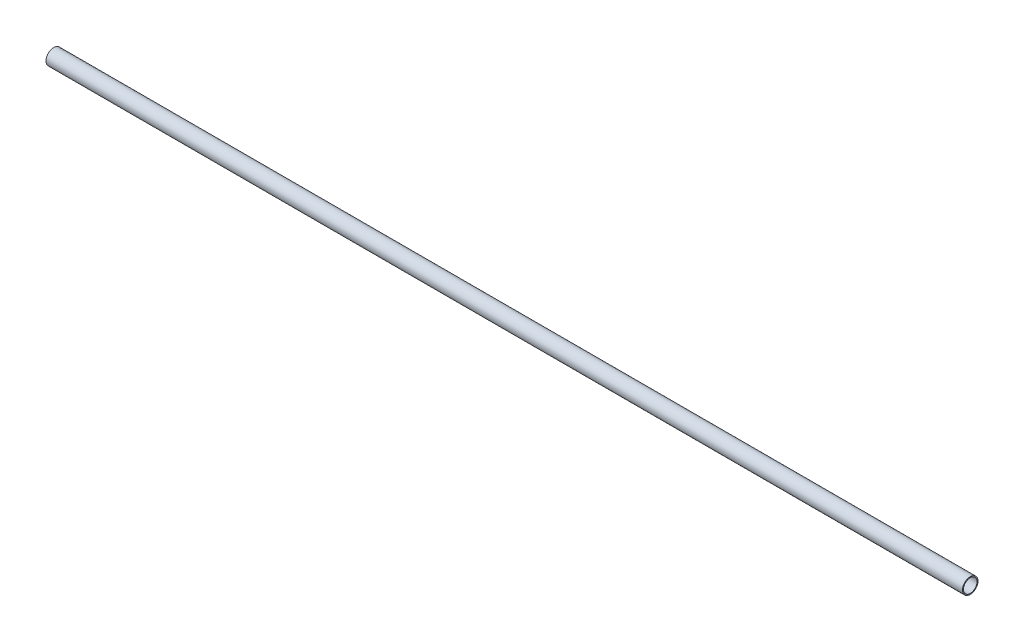
ISO-10303-21;
HEADER;
FILE_DESCRIPTION(('STEP AP214'),'2;1');
FILE_NAME('part.step','',(''),(''),'','','');
FILE_SCHEMA(('AUTOMOTIVE_DESIGN { 1 0 10303 214 1 1 1 1 }'));
ENDSEC;
DATA;
#1=APPLICATION_CONTEXT('core data for automotive mechanical design processes');
#2=APPLICATION_PROTOCOL_DEFINITION('international standard','automotive_design',2000,#1);
#3=PRODUCT_CONTEXT('',#1,'mechanical');
#4=PRODUCT('Part','Part','',(#3));
#5=PRODUCT_RELATED_PRODUCT_CATEGORY('part','',(#4));
#6=PRODUCT_DEFINITION_FORMATION('','',#4);
#7=PRODUCT_DEFINITION_CONTEXT('part definition',#1,'design');
#8=PRODUCT_DEFINITION('design','',#6,#7);
#9=PRODUCT_DEFINITION_SHAPE('','',#8);
#10=(LENGTH_UNIT() NAMED_UNIT(*) SI_UNIT(.MILLI.,.METRE.));
#11=(NAMED_UNIT(*) PLANE_ANGLE_UNIT() SI_UNIT($,.RADIAN.));
#12=(NAMED_UNIT(*) SI_UNIT($,.STERADIAN.) SOLID_ANGLE_UNIT());
#13=UNCERTAINTY_MEASURE_WITH_UNIT(LENGTH_MEASURE(1.E-05),#10,'distance_accuracy_value','');
#14=(GEOMETRIC_REPRESENTATION_CONTEXT(3) GLOBAL_UNCERTAINTY_ASSIGNED_CONTEXT((#13)) GLOBAL_UNIT_ASSIGNED_CONTEXT((#10,
#11,#12)) REPRESENTATION_CONTEXT('',''));
#15=CARTESIAN_POINT('',(0.,0.,0.));
#16=DIRECTION('',(0.,0.,1.));
#17=DIRECTION('',(1.,0.,0.));
#18=AXIS2_PLACEMENT_3D('',#15,#16,#17);
#19=CARTESIAN_POINT('',(-749.3,0.,0.));
#20=DIRECTION('',(1.,0.,0.));
#21=DIRECTION('',(0.,0.,-1.));
#22=AXIS2_PLACEMENT_3D('',#19,#20,#21);
#23=CYLINDRICAL_SURFACE('',#22,11.1125);
#24=CARTESIAN_POINT('',(-749.3,0.,0.));
#25=DIRECTION('',(1.,0.,0.));
#26=DIRECTION('',(0.,0.,-1.));
#27=AXIS2_PLACEMENT_3D('',#24,#25,#26);
#28=CIRCLE('',#27,11.1125);
#29=CARTESIAN_POINT('',(-749.3,0.,-11.1125));
#30=VERTEX_POINT('',#29);
#31=EDGE_CURVE('E44',#30,#30,#28,.T.);
#32=CARTESIAN_POINT('',(749.3,0.,0.));
#33=DIRECTION('',(1.,0.,0.));
#34=DIRECTION('',(0.,0.,-1.));
#35=AXIS2_PLACEMENT_3D('',#32,#33,#34);
#36=CIRCLE('',#35,11.1125);
#37=CARTESIAN_POINT('',(749.3,0.,-11.1125));
#38=VERTEX_POINT('',#37);
#39=EDGE_CURVE('E54',#38,#38,#36,.T.);
#40=CARTESIAN_POINT('',(-749.3,0.,-11.1125));
#41=CARTESIAN_POINT('',(-733.689583333333,0.,-11.1125));
#42=CARTESIAN_POINT('',(-718.079166666667,0.,-11.1125));
#43=CARTESIAN_POINT('',(-686.858333333333,0.,-11.1125));
#44=CARTESIAN_POINT('',(-671.247916666667,0.,-11.1125));
#45=CARTESIAN_POINT('',(-640.027083333333,0.,-11.1125));
#46=CARTESIAN_POINT('',(-624.416666666667,0.,-11.1125));
#47=CARTESIAN_POINT('',(-593.195833333333,0.,-11.1125));
#48=CARTESIAN_POINT('',(-577.585416666667,0.,-11.1125));
#49=CARTESIAN_POINT('',(-546.364583333333,0.,-11.1125));
#50=CARTESIAN_POINT('',(-530.754166666667,0.,-11.1125));
#51=CARTESIAN_POINT('',(-499.533333333333,0.,-11.1125));
#52=CARTESIAN_POINT('',(-483.922916666667,0.,-11.1125));
#53=CARTESIAN_POINT('',(-452.702083333333,0.,-11.1125));
#54=CARTESIAN_POINT('',(-437.091666666667,0.,-11.1125));
#55=CARTESIAN_POINT('',(-405.870833333333,0.,-11.1125));
#56=CARTESIAN_POINT('',(-390.260416666667,0.,-11.1125));
#57=CARTESIAN_POINT('',(-359.039583333333,0.,-11.1125));
#58=CARTESIAN_POINT('',(-343.429166666667,0.,-11.1125));
#59=CARTESIAN_POINT('',(-312.208333333333,0.,-11.1125));
#60=CARTESIAN_POINT('',(-296.597916666667,0.,-11.1125));
#61=CARTESIAN_POINT('',(-265.377083333333,0.,-11.1125));
#62=CARTESIAN_POINT('',(-249.766666666667,0.,-11.1125));
#63=CARTESIAN_POINT('',(-218.545833333333,0.,-11.1125));
#64=CARTESIAN_POINT('',(-202.935416666667,0.,-11.1125));
#65=CARTESIAN_POINT('',(-171.714583333333,0.,-11.1125));
#66=CARTESIAN_POINT('',(-156.104166666667,0.,-11.1125));
#67=CARTESIAN_POINT('',(-124.883333333333,0.,-11.1125));
#68=CARTESIAN_POINT('',(-109.272916666667,0.,-11.1125));
#69=CARTESIAN_POINT('',(-78.0520833333333,0.,-11.1125));
#70=CARTESIAN_POINT('',(-62.4416666666667,0.,-11.1125));
#71=CARTESIAN_POINT('',(-31.2208333333333,0.,-11.1125));
#72=CARTESIAN_POINT('',(-15.6104166666667,0.,-11.1125));
#73=CARTESIAN_POINT('',(15.6104166666667,0.,-11.1125));
#74=CARTESIAN_POINT('',(31.2208333333333,0.,-11.1125));
#75=CARTESIAN_POINT('',(62.4416666666667,0.,-11.1125));
#76=CARTESIAN_POINT('',(78.0520833333333,0.,-11.1125));
#77=CARTESIAN_POINT('',(109.272916666667,0.,-11.1125));
#78=CARTESIAN_POINT('',(124.883333333333,0.,-11.1125));
#79=CARTESIAN_POINT('',(156.104166666667,0.,-11.1125));
#80=CARTESIAN_POINT('',(171.714583333333,0.,-11.1125));
#81=CARTESIAN_POINT('',(202.935416666667,0.,-11.1125));
#82=CARTESIAN_POINT('',(218.545833333333,0.,-11.1125));
#83=CARTESIAN_POINT('',(249.766666666667,0.,-11.1125));
#84=CARTESIAN_POINT('',(265.377083333333,0.,-11.1125));
#85=CARTESIAN_POINT('',(296.597916666666,0.,-11.1125));
#86=CARTESIAN_POINT('',(312.208333333333,0.,-11.1125));
#87=CARTESIAN_POINT('',(343.429166666667,0.,-11.1125));
#88=CARTESIAN_POINT('',(359.039583333333,0.,-11.1125));
#89=CARTESIAN_POINT('',(390.260416666667,0.,-11.1125));
#90=CARTESIAN_POINT('',(405.870833333333,0.,-11.1125));
#91=CARTESIAN_POINT('',(437.091666666667,0.,-11.1125));
#92=CARTESIAN_POINT('',(452.702083333333,0.,-11.1125));
#93=CARTESIAN_POINT('',(483.922916666667,0.,-11.1125));
#94=CARTESIAN_POINT('',(499.533333333333,0.,-11.1125));
#95=CARTESIAN_POINT('',(530.754166666667,0.,-11.1125));
#96=CARTESIAN_POINT('',(546.364583333333,0.,-11.1125));
#97=CARTESIAN_POINT('',(577.585416666667,0.,-11.1125));
#98=CARTESIAN_POINT('',(593.195833333333,0.,-11.1125));
#99=CARTESIAN_POINT('',(624.416666666667,0.,-11.1125));
#100=CARTESIAN_POINT('',(640.027083333333,0.,-11.1125));
#101=CARTESIAN_POINT('',(671.247916666667,0.,-11.1125));
#102=CARTESIAN_POINT('',(686.858333333333,0.,-11.1125));
#103=CARTESIAN_POINT('',(718.079166666667,0.,-11.1125));
#104=CARTESIAN_POINT('',(733.689583333333,0.,-11.1125));
#105=CARTESIAN_POINT('',(749.3,0.,-11.1125));
#106=B_SPLINE_CURVE_WITH_KNOTS('',3,(#40,#41,#42,#43,#44,#45,#46,#47,#48,#49,#50,#51,#52,#53,
#54,#55,#56,#57,#58,#59,#60,#61,#62,#63,#64,#65,#66,#67,#68,#69,#70,#71,#72,#73,#74,#75,#76,#77,
#78,#79,#80,#81,#82,#83,#84,#85,#86,#87,#88,#89,#90,#91,#92,#93,#94,#95,#96,#97,#98,#99,#100,
#101,#102,#103,#104,#105),.UNSPECIFIED.,.F.,.F.,(4,2,2,2,2,2,2,2,2,2,2,2,2,2,2,2,2,2,2,2,2,2,2,
2,2,2,2,2,2,2,2,2,4),(0.,46.83125,93.6625,140.49375,187.325,234.15625,280.9875,327.81875,374.65,
421.48125,468.3125,515.14375,561.975,608.80625,655.6375,702.46875,749.3,796.13125,842.9625,
889.79375,936.625,983.45625,1030.2875,1077.11875,1123.95,1170.78125,1217.6125,1264.44375,
1311.275,1358.10625,1404.9375,1451.76875,1498.6),.UNSPECIFIED.);
#107=EDGE_CURVE('BSEAM37',#30,#38,#106,.T.);
#108=ORIENTED_EDGE('',*,*,#31,.F.);
#109=ORIENTED_EDGE('',*,*,#39,.T.);
#110=ORIENTED_EDGE('',*,*,#107,.T.);
#111=ORIENTED_EDGE('',*,*,#107,.F.);
#112=EDGE_LOOP('',(#108,#110,#109,#111));
#113=FACE_BOUND('',#112,.T.);
#114=ADVANCED_FACE('F37',(#113),#23,.F.);
#115=CARTESIAN_POINT('',(-749.3,0.,0.));
#116=DIRECTION('',(1.,0.,0.));
#117=DIRECTION('',(0.,0.,-1.));
#118=AXIS2_PLACEMENT_3D('',#115,#116,#117);
#119=CYLINDRICAL_SURFACE('',#118,12.7);
#120=CARTESIAN_POINT('',(-749.3,0.,0.));
#121=DIRECTION('',(1.,0.,0.));
#122=DIRECTION('',(0.,0.,-1.));
#123=AXIS2_PLACEMENT_3D('',#120,#121,#122);
#124=CIRCLE('',#123,12.7);
#125=CARTESIAN_POINT('',(-749.3,0.,-12.7));
#126=VERTEX_POINT('',#125);
#127=EDGE_CURVE('E10',#126,#126,#124,.T.);
#128=CARTESIAN_POINT('',(749.3,0.,0.));
#129=DIRECTION('',(1.,0.,0.));
#130=DIRECTION('',(0.,0.,-1.));
#131=AXIS2_PLACEMENT_3D('',#128,#129,#130);
#132=CIRCLE('',#131,12.7);
#133=CARTESIAN_POINT('',(749.3,0.,-12.7));
#134=VERTEX_POINT('',#133);
#135=EDGE_CURVE('E49',#134,#134,#132,.T.);
#136=CARTESIAN_POINT('',(-749.3,0.,-12.7));
#137=CARTESIAN_POINT('',(-733.689583333333,0.,-12.7));
#138=CARTESIAN_POINT('',(-718.079166666667,0.,-12.7));
#139=CARTESIAN_POINT('',(-686.858333333333,0.,-12.7));
#140=CARTESIAN_POINT('',(-671.247916666667,0.,-12.7));
#141=CARTESIAN_POINT('',(-640.027083333333,0.,-12.7));
#142=CARTESIAN_POINT('',(-624.416666666667,0.,-12.7));
#143=CARTESIAN_POINT('',(-593.195833333333,0.,-12.7));
#144=CARTESIAN_POINT('',(-577.585416666667,0.,-12.7));
#145=CARTESIAN_POINT('',(-546.364583333333,0.,-12.7));
#146=CARTESIAN_POINT('',(-530.754166666667,0.,-12.7));
#147=CARTESIAN_POINT('',(-499.533333333333,0.,-12.7));
#148=CARTESIAN_POINT('',(-483.922916666667,0.,-12.7));
#149=CARTESIAN_POINT('',(-452.702083333333,0.,-12.7));
#150=CARTESIAN_POINT('',(-437.091666666667,0.,-12.7));
#151=CARTESIAN_POINT('',(-405.870833333333,0.,-12.7));
#152=CARTESIAN_POINT('',(-390.260416666667,0.,-12.7));
#153=CARTESIAN_POINT('',(-359.039583333333,0.,-12.7));
#154=CARTESIAN_POINT('',(-343.429166666667,0.,-12.7));
#155=CARTESIAN_POINT('',(-312.208333333333,0.,-12.7));
#156=CARTESIAN_POINT('',(-296.597916666667,0.,-12.7));
#157=CARTESIAN_POINT('',(-265.377083333333,0.,-12.7));
#158=CARTESIAN_POINT('',(-249.766666666667,0.,-12.7));
#159=CARTESIAN_POINT('',(-218.545833333333,0.,-12.7));
#160=CARTESIAN_POINT('',(-202.935416666667,0.,-12.7));
#161=CARTESIAN_POINT('',(-171.714583333333,0.,-12.7));
#162=CARTESIAN_POINT('',(-156.104166666667,0.,-12.7));
#163=CARTESIAN_POINT('',(-124.883333333333,0.,-12.7));
#164=CARTESIAN_POINT('',(-109.272916666667,0.,-12.7));
#165=CARTESIAN_POINT('',(-78.0520833333334,0.,-12.7));
#166=CARTESIAN_POINT('',(-62.4416666666668,0.,-12.7));
#167=CARTESIAN_POINT('',(-31.2208333333334,0.,-12.7));
#168=CARTESIAN_POINT('',(-15.6104166666668,0.,-12.7));
#169=CARTESIAN_POINT('',(15.6104166666666,0.,-12.7));
#170=CARTESIAN_POINT('',(31.2208333333332,0.,-12.7));
#171=CARTESIAN_POINT('',(62.4416666666665,0.,-12.7));
#172=CARTESIAN_POINT('',(78.0520833333332,0.,-12.7));
#173=CARTESIAN_POINT('',(109.272916666667,0.,-12.7));
#174=CARTESIAN_POINT('',(124.883333333333,0.,-12.7));
#175=CARTESIAN_POINT('',(156.104166666667,0.,-12.7));
#176=CARTESIAN_POINT('',(171.714583333333,0.,-12.7));
#177=CARTESIAN_POINT('',(202.935416666667,0.,-12.7));
#178=CARTESIAN_POINT('',(218.545833333333,0.,-12.7));
#179=CARTESIAN_POINT('',(249.766666666667,0.,-12.7));
#180=CARTESIAN_POINT('',(265.377083333333,0.,-12.7));
#181=CARTESIAN_POINT('',(296.597916666666,0.,-12.7));
#182=CARTESIAN_POINT('',(312.208333333333,0.,-12.7));
#183=CARTESIAN_POINT('',(343.429166666667,0.,-12.7));
#184=CARTESIAN_POINT('',(359.039583333333,0.,-12.7));
#185=CARTESIAN_POINT('',(390.260416666667,0.,-12.7));
#186=CARTESIAN_POINT('',(405.870833333333,0.,-12.7));
#187=CARTESIAN_POINT('',(437.091666666667,0.,-12.7));
#188=CARTESIAN_POINT('',(452.702083333333,0.,-12.7));
#189=CARTESIAN_POINT('',(483.922916666667,0.,-12.7));
#190=CARTESIAN_POINT('',(499.533333333333,0.,-12.7));
#191=CARTESIAN_POINT('',(530.754166666667,0.,-12.7));
#192=CARTESIAN_POINT('',(546.364583333333,0.,-12.7));
#193=CARTESIAN_POINT('',(577.585416666667,0.,-12.7));
#194=CARTESIAN_POINT('',(593.195833333333,0.,-12.7));
#195=CARTESIAN_POINT('',(624.416666666667,0.,-12.7));
#196=CARTESIAN_POINT('',(640.027083333333,0.,-12.7));
#197=CARTESIAN_POINT('',(671.247916666667,0.,-12.7));
#198=CARTESIAN_POINT('',(686.858333333333,0.,-12.7));
#199=CARTESIAN_POINT('',(718.079166666667,0.,-12.7));
#200=CARTESIAN_POINT('',(733.689583333333,0.,-12.7));
#201=CARTESIAN_POINT('',(749.3,0.,-12.7));
#202=B_SPLINE_CURVE_WITH_KNOTS('',3,(#136,#137,#138,#139,#140,#141,#142,#143,#144,#145,#146,
#147,#148,#149,#150,#151,#152,#153,#154,#155,#156,#157,#158,#159,#160,#161,#162,#163,#164,#165,
#166,#167,#168,#169,#170,#171,#172,#173,#174,#175,#176,#177,#178,#179,#180,#181,#182,#183,#184,
#185,#186,#187,#188,#189,#190,#191,#192,#193,#194,#195,#196,#197,#198,#199,#200,#201),
.UNSPECIFIED.,.F.,.F.,(4,2,2,2,2,2,2,2,2,2,2,2,2,2,2,2,2,2,2,2,2,2,2,2,2,2,2,2,2,2,2,2,4),(0.,
46.8312500000001,93.6625000000001,140.49375,187.325,234.15625,280.9875,327.81875,374.65,
421.48125,468.3125,515.14375,561.975,608.80625,655.6375,702.46875,749.3,796.13125,842.9625,
889.79375,936.625,983.45625,1030.2875,1077.11875,1123.95,1170.78125,1217.6125,1264.44375,
1311.275,1358.10625,1404.9375,1451.76875,1498.6),.UNSPECIFIED.);
#203=EDGE_CURVE('BSEAM69',#126,#134,#202,.T.);
#204=ORIENTED_EDGE('',*,*,#127,.T.);
#205=ORIENTED_EDGE('',*,*,#135,.F.);
#206=ORIENTED_EDGE('',*,*,#203,.T.);
#207=ORIENTED_EDGE('',*,*,#203,.F.);
#208=EDGE_LOOP('',(#204,#206,#205,#207));
#209=FACE_BOUND('',#208,.T.);
#210=ADVANCED_FACE('F69',(#209),#119,.T.);
#211=CARTESIAN_POINT('',(-749.3,0.,0.));
#212=DIRECTION('',(1.,0.,0.));
#213=DIRECTION('',(0.,0.,-1.));
#214=AXIS2_PLACEMENT_3D('',#211,#212,#213);
#215=PLANE('',#214);
#216=ORIENTED_EDGE('',*,*,#31,.T.);
#217=EDGE_LOOP('',(#216));
#218=FACE_BOUND('',#217,.T.);
#219=ORIENTED_EDGE('',*,*,#127,.F.);
#220=EDGE_LOOP('',(#219));
#221=FACE_BOUND('',#220,.T.);
#222=ADVANCED_FACE('F65',(#218,#221),#215,.F.);
#223=CARTESIAN_POINT('',(749.3,0.,0.));
#224=DIRECTION('',(1.,0.,0.));
#225=DIRECTION('',(0.,0.,-1.));
#226=AXIS2_PLACEMENT_3D('',#223,#224,#225);
#227=PLANE('',#226);
#228=ORIENTED_EDGE('',*,*,#39,.F.);
#229=EDGE_LOOP('',(#228));
#230=FACE_BOUND('',#229,.T.);
#231=ORIENTED_EDGE('',*,*,#135,.T.);
#232=EDGE_LOOP('',(#231));
#233=FACE_BOUND('',#232,.T.);
#234=ADVANCED_FACE('F62',(#230,#233),#227,.T.);
#235=CLOSED_SHELL('',(#114,#210,#222,#234));
#236=MANIFOLD_SOLID_BREP('B2',#235);
#237=ADVANCED_BREP_SHAPE_REPRESENTATION('',(#18,#236),#14);
#238=SHAPE_DEFINITION_REPRESENTATION(#9,#237);
ENDSEC;
END-ISO-10303-21;
